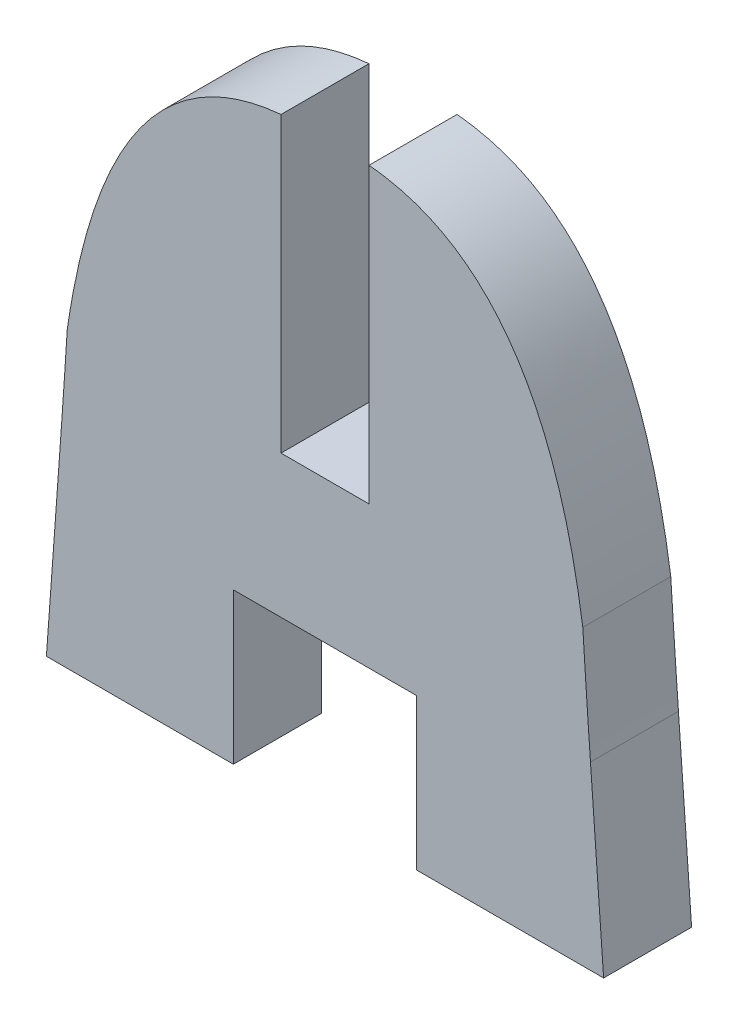
ISO-10303-21;
HEADER;
FILE_DESCRIPTION(('STEP AP214'),'2;1');
FILE_NAME('part.step','',(''),(''),'','','');
FILE_SCHEMA(('AUTOMOTIVE_DESIGN { 1 0 10303 214 1 1 1 1 }'));
ENDSEC;
DATA;
#1=APPLICATION_CONTEXT('core data for automotive mechanical design processes');
#2=APPLICATION_PROTOCOL_DEFINITION('international standard','automotive_design',2000,#1);
#3=PRODUCT_CONTEXT('',#1,'mechanical');
#4=PRODUCT('Part','Part','',(#3));
#5=PRODUCT_RELATED_PRODUCT_CATEGORY('part','',(#4));
#6=PRODUCT_DEFINITION_FORMATION('','',#4);
#7=PRODUCT_DEFINITION_CONTEXT('part definition',#1,'design');
#8=PRODUCT_DEFINITION('design','',#6,#7);
#9=PRODUCT_DEFINITION_SHAPE('','',#8);
#10=(LENGTH_UNIT() NAMED_UNIT(*) SI_UNIT(.MILLI.,.METRE.));
#11=(NAMED_UNIT(*) PLANE_ANGLE_UNIT() SI_UNIT($,.RADIAN.));
#12=(NAMED_UNIT(*) SI_UNIT($,.STERADIAN.) SOLID_ANGLE_UNIT());
#13=UNCERTAINTY_MEASURE_WITH_UNIT(LENGTH_MEASURE(1.E-05),#10,'distance_accuracy_value','');
#14=(GEOMETRIC_REPRESENTATION_CONTEXT(3) GLOBAL_UNCERTAINTY_ASSIGNED_CONTEXT((#13)) GLOBAL_UNIT_ASSIGNED_CONTEXT((#10,
#11,#12)) REPRESENTATION_CONTEXT('',''));
#15=CARTESIAN_POINT('',(0.,0.,0.));
#16=DIRECTION('',(0.,0.,1.));
#17=DIRECTION('',(1.,0.,0.));
#18=AXIS2_PLACEMENT_3D('',#15,#16,#17);
#19=CARTESIAN_POINT('',(18.2899589170951,10.0000000000003,3.));
#20=CARTESIAN_POINT('',(16.9126870363201,19.459463986445,3.));
#21=CARTESIAN_POINT('',(11.0000000000001,20.0000000000003,3.));
#22=B_SPLINE_CURVE_WITH_KNOTS('',2,(#19,#20,#21),.UNSPECIFIED.,.F.,.F.,(3,3),(0.,
0.891892797285202),.UNSPECIFIED.);
#23=DIRECTION('',(0.,0.,-1.));
#24=VECTOR('',#23,1.);
#25=SURFACE_OF_LINEAR_EXTRUSION('',#22,#24);
#26=CARTESIAN_POINT('',(18.2899589170951,10.0000000000003,0.));
#27=CARTESIAN_POINT('',(16.9126870363201,19.459463986445,0.));
#28=CARTESIAN_POINT('',(11.0000000000001,20.0000000000003,0.));
#29=B_SPLINE_CURVE_WITH_KNOTS('',2,(#26,#27,#28),.UNSPECIFIED.,.F.,.F.,(3,3),(0.,
0.891892797285202),.UNSPECIFIED.);
#30=CARTESIAN_POINT('',(18.2899589170951,10.0000000000001,0.));
#31=VERTEX_POINT('',#30);
#32=CARTESIAN_POINT('',(11.0000000000001,20.0000000000003,0.));
#33=VERTEX_POINT('',#32);
#34=EDGE_CURVE('E169',#31,#33,#29,.T.);
#35=ORIENTED_EDGE('',*,*,#34,.T.);
#36=DIRECTION('',(0.,0.,-1.));
#37=VECTOR('',#36,1.);
#38=CARTESIAN_POINT('',(11.0000000000001,20.0000000000003,3.));
#39=LINE('',#38,#37);
#40=CARTESIAN_POINT('',(11.0000000000001,20.0000000000003,3.));
#41=VERTEX_POINT('',#40);
#42=EDGE_CURVE('E11',#41,#33,#39,.T.);
#43=ORIENTED_EDGE('',*,*,#42,.F.);
#44=CARTESIAN_POINT('',(18.2899589170951,10.0000000000001,3.));
#45=VERTEX_POINT('',#44);
#46=EDGE_CURVE('E206',#45,#41,#22,.T.);
#47=ORIENTED_EDGE('',*,*,#46,.F.);
#48=DIRECTION('',(0.,0.,-1.));
#49=VECTOR('',#48,1.);
#50=CARTESIAN_POINT('',(18.2899589170951,10.0000000000001,3.));
#51=LINE('',#50,#49);
#52=EDGE_CURVE('E165',#45,#31,#51,.T.);
#53=ORIENTED_EDGE('',*,*,#52,.T.);
#54=EDGE_LOOP('',(#35,#43,#47,#53));
#55=FACE_BOUND('',#54,.T.);
#56=ADVANCED_FACE('F36',(#55),#25,.F.);
#57=CARTESIAN_POINT('',(11.0000000000001,20.0000000000003,3.));
#58=DIRECTION('',(1.,0.,0.));
#59=DIRECTION('',(0.,0.,-1.));
#60=AXIS2_PLACEMENT_3D('',#57,#58,#59);
#61=PLANE('',#60);
#62=DIRECTION('',(0.,-1.,0.));
#63=VECTOR('',#62,1.);
#64=CARTESIAN_POINT('',(11.0000000000001,20.0000000000003,0.));
#65=LINE('',#64,#63);
#66=CARTESIAN_POINT('',(11.0000000000001,10.0000000000003,0.));
#67=VERTEX_POINT('',#66);
#68=EDGE_CURVE('E174',#33,#67,#65,.T.);
#69=ORIENTED_EDGE('',*,*,#68,.T.);
#70=DIRECTION('',(0.,0.,-1.));
#71=VECTOR('',#70,1.);
#72=CARTESIAN_POINT('',(11.0000000000001,10.0000000000003,3.));
#73=LINE('',#72,#71);
#74=CARTESIAN_POINT('',(11.0000000000001,10.0000000000003,3.));
#75=VERTEX_POINT('',#74);
#76=EDGE_CURVE('E45',#75,#67,#73,.T.);
#77=ORIENTED_EDGE('',*,*,#76,.F.);
#78=DIRECTION('',(0.,-1.,0.));
#79=VECTOR('',#78,1.);
#80=CARTESIAN_POINT('',(11.0000000000001,20.0000000000003,3.));
#81=LINE('',#80,#79);
#82=EDGE_CURVE('E114',#41,#75,#81,.T.);
#83=ORIENTED_EDGE('',*,*,#82,.F.);
#84=ORIENTED_EDGE('',*,*,#42,.T.);
#85=EDGE_LOOP('',(#69,#77,#83,#84));
#86=FACE_BOUND('',#85,.T.);
#87=ADVANCED_FACE('F279',(#86),#61,.F.);
#88=CARTESIAN_POINT('',(8.00000000000006,10.0000000000003,3.));
#89=DIRECTION('',(0.,-1.,0.));
#90=DIRECTION('',(0.,0.,-1.));
#91=AXIS2_PLACEMENT_3D('',#88,#89,#90);
#92=PLANE('',#91);
#93=DIRECTION('',(-1.,0.,0.));
#94=VECTOR('',#93,1.);
#95=CARTESIAN_POINT('',(8.00000000000006,10.0000000000003,0.));
#96=LINE('',#95,#94);
#97=CARTESIAN_POINT('',(8.00000000000006,10.0000000000003,0.));
#98=VERTEX_POINT('',#97);
#99=EDGE_CURVE('E179',#67,#98,#96,.T.);
#100=ORIENTED_EDGE('',*,*,#99,.T.);
#101=DIRECTION('',(0.,0.,-1.));
#102=VECTOR('',#101,1.);
#103=CARTESIAN_POINT('',(8.00000000000006,10.0000000000003,3.));
#104=LINE('',#103,#102);
#105=CARTESIAN_POINT('',(8.00000000000006,10.0000000000003,3.));
#106=VERTEX_POINT('',#105);
#107=EDGE_CURVE('E231',#106,#98,#104,.T.);
#108=ORIENTED_EDGE('',*,*,#107,.F.);
#109=DIRECTION('',(-1.,0.,0.));
#110=VECTOR('',#109,1.);
#111=CARTESIAN_POINT('',(8.00000000000006,10.0000000000003,3.));
#112=LINE('',#111,#110);
#113=EDGE_CURVE('E239',#75,#106,#112,.T.);
#114=ORIENTED_EDGE('',*,*,#113,.F.);
#115=ORIENTED_EDGE('',*,*,#76,.T.);
#116=EDGE_LOOP('',(#100,#108,#114,#115));
#117=FACE_BOUND('',#116,.T.);
#118=ADVANCED_FACE('F237',(#117),#92,.F.);
#119=CARTESIAN_POINT('',(8.00000000000006,10.0000000000003,3.));
#120=DIRECTION('',(-1.,0.,0.));
#121=DIRECTION('',(0.,0.,1.));
#122=AXIS2_PLACEMENT_3D('',#119,#120,#121);
#123=PLANE('',#122);
#124=DIRECTION('',(0.,1.,0.));
#125=VECTOR('',#124,1.);
#126=CARTESIAN_POINT('',(8.00000000000006,10.0000000000003,0.));
#127=LINE('',#126,#125);
#128=CARTESIAN_POINT('',(8.00000000000006,20.0000000000003,0.));
#129=VERTEX_POINT('',#128);
#130=EDGE_CURVE('E181',#98,#129,#127,.T.);
#131=ORIENTED_EDGE('',*,*,#130,.T.);
#132=DIRECTION('',(0.,0.,-1.));
#133=VECTOR('',#132,1.);
#134=CARTESIAN_POINT('',(8.00000000000006,20.0000000000003,3.));
#135=LINE('',#134,#133);
#136=CARTESIAN_POINT('',(8.00000000000006,20.0000000000003,3.));
#137=VERTEX_POINT('',#136);
#138=EDGE_CURVE('E228',#137,#129,#135,.T.);
#139=ORIENTED_EDGE('',*,*,#138,.F.);
#140=DIRECTION('',(0.,1.,0.));
#141=VECTOR('',#140,1.);
#142=CARTESIAN_POINT('',(8.00000000000006,10.0000000000003,3.));
#143=LINE('',#142,#141);
#144=EDGE_CURVE('E257',#106,#137,#143,.T.);
#145=ORIENTED_EDGE('',*,*,#144,.F.);
#146=ORIENTED_EDGE('',*,*,#107,.T.);
#147=EDGE_LOOP('',(#131,#139,#145,#146));
#148=FACE_BOUND('',#147,.T.);
#149=ADVANCED_FACE('F248',(#148),#123,.F.);
#150=CARTESIAN_POINT('',(8.00000000000006,20.0000000000003,3.));
#151=CARTESIAN_POINT('',(2.08731296368017,19.459463986445,3.));
#152=CARTESIAN_POINT('',(0.71004108290551,10.0000000000003,3.));
#153=B_SPLINE_CURVE_WITH_KNOTS('',2,(#150,#151,#152),.UNSPECIFIED.,.F.,.F.,(3,3),(0.,
0.891892797285201),.UNSPECIFIED.);
#154=DIRECTION('',(0.,0.,-1.));
#155=VECTOR('',#154,1.);
#156=SURFACE_OF_LINEAR_EXTRUSION('',#153,#155);
#157=CARTESIAN_POINT('',(8.00000000000006,20.0000000000003,0.));
#158=CARTESIAN_POINT('',(2.08731296368017,19.459463986445,0.));
#159=CARTESIAN_POINT('',(0.71004108290551,10.0000000000003,0.));
#160=B_SPLINE_CURVE_WITH_KNOTS('',2,(#157,#158,#159),.UNSPECIFIED.,.F.,.F.,(3,3),(0.,
0.891892797285201),.UNSPECIFIED.);
#161=CARTESIAN_POINT('',(0.71004108290551,10.0000000000003,0.));
#162=VERTEX_POINT('',#161);
#163=EDGE_CURVE('E183',#129,#162,#160,.T.);
#164=ORIENTED_EDGE('',*,*,#163,.T.);
#165=DIRECTION('',(0.,0.,-1.));
#166=VECTOR('',#165,1.);
#167=CARTESIAN_POINT('',(0.71004108290551,10.0000000000003,3.));
#168=LINE('',#167,#166);
#169=CARTESIAN_POINT('',(0.71004108290551,10.0000000000003,3.));
#170=VERTEX_POINT('',#169);
#171=EDGE_CURVE('E225',#170,#162,#168,.T.);
#172=ORIENTED_EDGE('',*,*,#171,.F.);
#173=EDGE_CURVE('E254',#137,#170,#153,.T.);
#174=ORIENTED_EDGE('',*,*,#173,.F.);
#175=ORIENTED_EDGE('',*,*,#138,.T.);
#176=EDGE_LOOP('',(#164,#172,#174,#175));
#177=FACE_BOUND('',#176,.T.);
#178=ADVANCED_FACE('F252',(#177),#156,.F.);
#179=CARTESIAN_POINT('',(-388.518777082135,34.5138146734916,3.));
#180=DIRECTION('',(0.,0.,-1.));
#181=DIRECTION('',(-1.,0.,0.));
#182=AXIS2_PLACEMENT_3D('',#179,#180,#181);
#183=CYLINDRICAL_SURFACE('',#182,390.);
#184=CARTESIAN_POINT('',(-388.518777082135,34.5138146734916,0.));
#185=DIRECTION('',(0.,0.,-1.));
#186=DIRECTION('',(1.,0.,0.));
#187=AXIS2_PLACEMENT_3D('',#184,#185,#186);
#188=CIRCLE('',#187,390.);
#189=CARTESIAN_POINT('',(0.448555141237317,6.15161336553631,0.));
#190=VERTEX_POINT('',#189);
#191=EDGE_CURVE('E187',#162,#190,#188,.T.);
#192=ORIENTED_EDGE('',*,*,#191,.T.);
#193=DIRECTION('',(0.,0.,-1.));
#194=VECTOR('',#193,1.);
#195=CARTESIAN_POINT('',(0.448555141237317,6.15161336553631,3.));
#196=LINE('',#195,#194);
#197=CARTESIAN_POINT('',(0.448555141237317,6.15161336553631,3.));
#198=VERTEX_POINT('',#197);
#199=EDGE_CURVE('E222',#198,#190,#196,.T.);
#200=ORIENTED_EDGE('',*,*,#199,.F.);
#201=CARTESIAN_POINT('',(-388.518777082135,34.5138146734916,3.));
#202=DIRECTION('',(0.,0.,-1.));
#203=DIRECTION('',(1.,0.,0.));
#204=AXIS2_PLACEMENT_3D('',#201,#202,#203);
#205=CIRCLE('',#204,390.);
#206=EDGE_CURVE('E256',#170,#198,#205,.T.);
#207=ORIENTED_EDGE('',*,*,#206,.F.);
#208=ORIENTED_EDGE('',*,*,#171,.T.);
#209=EDGE_LOOP('',(#192,#200,#207,#208));
#210=FACE_BOUND('',#209,.T.);
#211=ADVANCED_FACE('F274',(#210),#183,.F.);
#212=CARTESIAN_POINT('',(0.,0.,3.));
#213=DIRECTION('',(0.997352133906081,-0.072723593097336,0.));
#214=DIRECTION('',(0.072723593097336,0.997352133906081,0.));
#215=AXIS2_PLACEMENT_3D('',#212,#213,#214);
#216=PLANE('',#215);
#217=DIRECTION('',(-0.072723593097336,-0.997352133906081,0.));
#218=VECTOR('',#217,1.);
#219=CARTESIAN_POINT('',(0.,0.,0.));
#220=LINE('',#219,#218);
#221=CARTESIAN_POINT('',(0.,0.,0.));
#222=VERTEX_POINT('',#221);
#223=EDGE_CURVE('E192',#190,#222,#220,.T.);
#224=ORIENTED_EDGE('',*,*,#223,.T.);
#225=DIRECTION('',(0.,0.,-1.));
#226=VECTOR('',#225,1.);
#227=CARTESIAN_POINT('',(0.,0.,3.));
#228=LINE('',#227,#226);
#229=CARTESIAN_POINT('',(0.,0.,3.));
#230=VERTEX_POINT('',#229);
#231=EDGE_CURVE('E219',#230,#222,#228,.T.);
#232=ORIENTED_EDGE('',*,*,#231,.F.);
#233=DIRECTION('',(-0.072723593097336,-0.997352133906081,0.));
#234=VECTOR('',#233,1.);
#235=CARTESIAN_POINT('',(0.,0.,3.));
#236=LINE('',#235,#234);
#237=EDGE_CURVE('E259',#198,#230,#236,.T.);
#238=ORIENTED_EDGE('',*,*,#237,.F.);
#239=ORIENTED_EDGE('',*,*,#199,.T.);
#240=EDGE_LOOP('',(#224,#232,#238,#239));
#241=FACE_BOUND('',#240,.T.);
#242=ADVANCED_FACE('F311',(#241),#216,.F.);
#243=CARTESIAN_POINT('',(6.37500000000006,0.,3.));
#244=DIRECTION('',(0.,1.,0.));
#245=DIRECTION('',(-1.,0.,0.));
#246=AXIS2_PLACEMENT_3D('',#243,#244,#245);
#247=PLANE('',#246);
#248=DIRECTION('',(1.,0.,0.));
#249=VECTOR('',#248,1.);
#250=CARTESIAN_POINT('',(6.37500000000006,0.,0.));
#251=LINE('',#250,#249);
#252=CARTESIAN_POINT('',(6.37500000000006,0.,0.));
#253=VERTEX_POINT('',#252);
#254=EDGE_CURVE('E194',#222,#253,#251,.T.);
#255=ORIENTED_EDGE('',*,*,#254,.T.);
#256=DIRECTION('',(0.,0.,-1.));
#257=VECTOR('',#256,1.);
#258=CARTESIAN_POINT('',(6.37500000000006,0.,3.));
#259=LINE('',#258,#257);
#260=CARTESIAN_POINT('',(6.37500000000006,0.,3.));
#261=VERTEX_POINT('',#260);
#262=EDGE_CURVE('E216',#261,#253,#259,.T.);
#263=ORIENTED_EDGE('',*,*,#262,.F.);
#264=DIRECTION('',(1.,0.,0.));
#265=VECTOR('',#264,1.);
#266=CARTESIAN_POINT('',(6.37500000000006,0.,3.));
#267=LINE('',#266,#265);
#268=EDGE_CURVE('E308',#230,#261,#267,.T.);
#269=ORIENTED_EDGE('',*,*,#268,.F.);
#270=ORIENTED_EDGE('',*,*,#231,.T.);
#271=EDGE_LOOP('',(#255,#263,#269,#270));
#272=FACE_BOUND('',#271,.T.);
#273=ADVANCED_FACE('F305',(#272),#247,.F.);
#274=CARTESIAN_POINT('',(6.37500000000006,5.15000000000078,3.));
#275=DIRECTION('',(-1.,0.,0.));
#276=DIRECTION('',(0.,0.,1.));
#277=AXIS2_PLACEMENT_3D('',#274,#275,#276);
#278=PLANE('',#277);
#279=DIRECTION('',(0.,1.,0.));
#280=VECTOR('',#279,1.);
#281=CARTESIAN_POINT('',(6.37500000000006,5.15000000000078,0.));
#282=LINE('',#281,#280);
#283=CARTESIAN_POINT('',(6.37500000000006,5.15000000000078,0.));
#284=VERTEX_POINT('',#283);
#285=EDGE_CURVE('E196',#253,#284,#282,.T.);
#286=ORIENTED_EDGE('',*,*,#285,.T.);
#287=DIRECTION('',(0.,0.,-1.));
#288=VECTOR('',#287,1.);
#289=CARTESIAN_POINT('',(6.37500000000006,5.15000000000078,3.));
#290=LINE('',#289,#288);
#291=CARTESIAN_POINT('',(6.37500000000006,5.15000000000078,3.));
#292=VERTEX_POINT('',#291);
#293=EDGE_CURVE('E213',#292,#284,#290,.T.);
#294=ORIENTED_EDGE('',*,*,#293,.F.);
#295=DIRECTION('',(0.,1.,0.));
#296=VECTOR('',#295,1.);
#297=CARTESIAN_POINT('',(6.37500000000006,5.15000000000078,3.));
#298=LINE('',#297,#296);
#299=EDGE_CURVE('E300',#261,#292,#298,.T.);
#300=ORIENTED_EDGE('',*,*,#299,.F.);
#301=ORIENTED_EDGE('',*,*,#262,.T.);
#302=EDGE_LOOP('',(#286,#294,#300,#301));
#303=FACE_BOUND('',#302,.T.);
#304=ADVANCED_FACE('F299',(#303),#278,.F.);
#305=CARTESIAN_POINT('',(12.6250000000001,5.15000000000078,3.));
#306=DIRECTION('',(0.,1.,0.));
#307=DIRECTION('',(0.,0.,1.));
#308=AXIS2_PLACEMENT_3D('',#305,#306,#307);
#309=PLANE('',#308);
#310=DIRECTION('',(1.,0.,0.));
#311=VECTOR('',#310,1.);
#312=CARTESIAN_POINT('',(12.6250000000001,5.15000000000078,0.));
#313=LINE('',#312,#311);
#314=CARTESIAN_POINT('',(12.6250000000001,5.15000000000078,0.));
#315=VERTEX_POINT('',#314);
#316=EDGE_CURVE('E199',#284,#315,#313,.T.);
#317=ORIENTED_EDGE('',*,*,#316,.T.);
#318=DIRECTION('',(0.,0.,-1.));
#319=VECTOR('',#318,1.);
#320=CARTESIAN_POINT('',(12.6250000000001,5.15000000000078,3.));
#321=LINE('',#320,#319);
#322=CARTESIAN_POINT('',(12.6250000000001,5.15000000000078,3.));
#323=VERTEX_POINT('',#322);
#324=EDGE_CURVE('E210',#323,#315,#321,.T.);
#325=ORIENTED_EDGE('',*,*,#324,.F.);
#326=DIRECTION('',(1.,0.,0.));
#327=VECTOR('',#326,1.);
#328=CARTESIAN_POINT('',(7.99999999996254,5.15000000000078,3.));
#329=LINE('',#328,#327);
#330=EDGE_CURVE('E295',#292,#323,#329,.T.);
#331=ORIENTED_EDGE('',*,*,#330,.F.);
#332=ORIENTED_EDGE('',*,*,#293,.T.);
#333=EDGE_LOOP('',(#317,#325,#331,#332));
#334=FACE_BOUND('',#333,.T.);
#335=ADVANCED_FACE('F294',(#334),#309,.F.);
#336=CARTESIAN_POINT('',(12.6250000000001,5.15000000000078,3.));
#337=DIRECTION('',(1.,0.,0.));
#338=DIRECTION('',(0.,0.,-1.));
#339=AXIS2_PLACEMENT_3D('',#336,#337,#338);
#340=PLANE('',#339);
#341=DIRECTION('',(0.,-1.,0.));
#342=VECTOR('',#341,1.);
#343=CARTESIAN_POINT('',(12.6250000000001,5.15000000000078,0.));
#344=LINE('',#343,#342);
#345=CARTESIAN_POINT('',(12.6250000000001,0.,0.));
#346=VERTEX_POINT('',#345);
#347=EDGE_CURVE('E201',#315,#346,#344,.T.);
#348=ORIENTED_EDGE('',*,*,#347,.T.);
#349=DIRECTION('',(0.,0.,-1.));
#350=VECTOR('',#349,1.);
#351=CARTESIAN_POINT('',(12.6250000000001,0.,3.));
#352=LINE('',#351,#350);
#353=CARTESIAN_POINT('',(12.6250000000001,0.,3.));
#354=VERTEX_POINT('',#353);
#355=EDGE_CURVE('E160',#354,#346,#352,.T.);
#356=ORIENTED_EDGE('',*,*,#355,.F.);
#357=DIRECTION('',(0.,-1.,0.));
#358=VECTOR('',#357,1.);
#359=CARTESIAN_POINT('',(12.6250000000001,5.15000000000078,3.));
#360=LINE('',#359,#358);
#361=EDGE_CURVE('E151',#323,#354,#360,.T.);
#362=ORIENTED_EDGE('',*,*,#361,.F.);
#363=ORIENTED_EDGE('',*,*,#324,.T.);
#364=EDGE_LOOP('',(#348,#356,#362,#363));
#365=FACE_BOUND('',#364,.T.);
#366=ADVANCED_FACE('F290',(#365),#340,.F.);
#367=CARTESIAN_POINT('',(19.0000000000001,1.11022302462516E-13,3.));
#368=DIRECTION('',(0.,1.,0.));
#369=DIRECTION('',(-1.,0.,0.));
#370=AXIS2_PLACEMENT_3D('',#367,#368,#369);
#371=PLANE('',#370);
#372=DIRECTION('',(1.,0.,0.));
#373=VECTOR('',#372,1.);
#374=CARTESIAN_POINT('',(19.0000000000001,1.11022302462516E-13,0.));
#375=LINE('',#374,#373);
#376=CARTESIAN_POINT('',(19.0000000000001,1.11022302462516E-13,0.));
#377=VERTEX_POINT('',#376);
#378=EDGE_CURVE('E159',#346,#377,#375,.T.);
#379=ORIENTED_EDGE('',*,*,#378,.T.);
#380=DIRECTION('',(0.,0.,-1.));
#381=VECTOR('',#380,1.);
#382=CARTESIAN_POINT('',(19.0000000000001,1.11022302462516E-13,3.));
#383=LINE('',#382,#381);
#384=CARTESIAN_POINT('',(19.0000000000001,1.11022302462516E-13,3.));
#385=VERTEX_POINT('',#384);
#386=EDGE_CURVE('E156',#385,#377,#383,.T.);
#387=ORIENTED_EDGE('',*,*,#386,.F.);
#388=DIRECTION('',(1.,0.,0.));
#389=VECTOR('',#388,1.);
#390=CARTESIAN_POINT('',(19.0000000000001,1.11022302462516E-13,3.));
#391=LINE('',#390,#389);
#392=EDGE_CURVE('E145',#354,#385,#391,.T.);
#393=ORIENTED_EDGE('',*,*,#392,.F.);
#394=ORIENTED_EDGE('',*,*,#355,.T.);
#395=EDGE_LOOP('',(#379,#387,#393,#394));
#396=FACE_BOUND('',#395,.T.);
#397=ADVANCED_FACE('F157',(#396),#371,.F.);
#398=CARTESIAN_POINT('',(19.0000000000001,1.11022302462516E-13,3.));
#399=DIRECTION('',(-0.997352133906081,-0.072723593097332,0.));
#400=DIRECTION('',(0.0727235930973321,-0.997352133906081,0.));
#401=AXIS2_PLACEMENT_3D('',#398,#399,#400);
#402=PLANE('',#401);
#403=DIRECTION('',(-0.0727235930973321,0.997352133906081,0.));
#404=VECTOR('',#403,1.);
#405=CARTESIAN_POINT('',(19.0000000000001,1.11022302462516E-13,0.));
#406=LINE('',#405,#404);
#407=CARTESIAN_POINT('',(18.5514448587631,6.15161336553502,0.));
#408=VERTEX_POINT('',#407);
#409=EDGE_CURVE('E100',#377,#408,#406,.T.);
#410=ORIENTED_EDGE('',*,*,#409,.T.);
#411=DIRECTION('',(0.,0.,-1.));
#412=VECTOR('',#411,1.);
#413=CARTESIAN_POINT('',(18.5514448587631,6.15161336553502,3.));
#414=LINE('',#413,#412);
#415=CARTESIAN_POINT('',(18.5514448587631,6.15161336553502,3.));
#416=VERTEX_POINT('',#415);
#417=EDGE_CURVE('E161',#416,#408,#414,.T.);
#418=ORIENTED_EDGE('',*,*,#417,.F.);
#419=DIRECTION('',(-0.0727235930973321,0.997352133906081,0.));
#420=VECTOR('',#419,1.);
#421=CARTESIAN_POINT('',(19.0000000000001,1.11022302462516E-13,3.));
#422=LINE('',#421,#420);
#423=EDGE_CURVE('E149',#385,#416,#422,.T.);
#424=ORIENTED_EDGE('',*,*,#423,.F.);
#425=ORIENTED_EDGE('',*,*,#386,.T.);
#426=EDGE_LOOP('',(#410,#418,#424,#425));
#427=FACE_BOUND('',#426,.T.);
#428=ADVANCED_FACE('F163',(#427),#402,.F.);
#429=CARTESIAN_POINT('',(407.518777082135,34.5138146734958,3.));
#430=DIRECTION('',(0.,0.,-1.));
#431=DIRECTION('',(-1.,0.,0.));
#432=AXIS2_PLACEMENT_3D('',#429,#430,#431);
#433=CYLINDRICAL_SURFACE('',#432,390.);
#434=CARTESIAN_POINT('',(407.518777082135,34.5138146734958,0.));
#435=DIRECTION('',(0.,0.,-1.));
#436=DIRECTION('',(-1.,0.,0.));
#437=AXIS2_PLACEMENT_3D('',#434,#435,#436);
#438=CIRCLE('',#437,390.);
#439=EDGE_CURVE('E106',#408,#31,#438,.T.);
#440=ORIENTED_EDGE('',*,*,#439,.T.);
#441=ORIENTED_EDGE('',*,*,#52,.F.);
#442=CARTESIAN_POINT('',(407.518777082135,34.5138146734958,3.));
#443=DIRECTION('',(0.,0.,-1.));
#444=DIRECTION('',(-1.,0.,0.));
#445=AXIS2_PLACEMENT_3D('',#442,#443,#444);
#446=CIRCLE('',#445,390.);
#447=EDGE_CURVE('E53',#416,#45,#446,.T.);
#448=ORIENTED_EDGE('',*,*,#447,.F.);
#449=ORIENTED_EDGE('',*,*,#417,.T.);
#450=EDGE_LOOP('',(#440,#441,#448,#449));
#451=FACE_BOUND('',#450,.T.);
#452=ADVANCED_FACE('F336',(#451),#433,.F.);
#453=CARTESIAN_POINT('',(15.7788332474338,17.2297319932227,3.));
#454=DIRECTION('',(0.,0.,-1.));
#455=DIRECTION('',(-1.,0.,0.));
#456=AXIS2_PLACEMENT_3D('',#453,#454,#455);
#457=PLANE('',#456);
#458=ORIENTED_EDGE('',*,*,#46,.T.);
#459=ORIENTED_EDGE('',*,*,#82,.T.);
#460=ORIENTED_EDGE('',*,*,#113,.T.);
#461=ORIENTED_EDGE('',*,*,#144,.T.);
#462=ORIENTED_EDGE('',*,*,#173,.T.);
#463=ORIENTED_EDGE('',*,*,#206,.T.);
#464=ORIENTED_EDGE('',*,*,#237,.T.);
#465=ORIENTED_EDGE('',*,*,#268,.T.);
#466=ORIENTED_EDGE('',*,*,#299,.T.);
#467=ORIENTED_EDGE('',*,*,#330,.T.);
#468=ORIENTED_EDGE('',*,*,#361,.T.);
#469=ORIENTED_EDGE('',*,*,#392,.T.);
#470=ORIENTED_EDGE('',*,*,#423,.T.);
#471=ORIENTED_EDGE('',*,*,#447,.T.);
#472=EDGE_LOOP('',(#458,#459,#460,#461,#462,#463,#464,#465,#466,#467,#468,#469,#470,#471));
#473=FACE_BOUND('',#472,.T.);
#474=ADVANCED_FACE('F147',(#473),#457,.F.);
#475=CARTESIAN_POINT('',(15.7788332474338,17.2297319932227,0.));
#476=DIRECTION('',(0.,0.,-1.));
#477=DIRECTION('',(-1.,0.,0.));
#478=AXIS2_PLACEMENT_3D('',#475,#476,#477);
#479=PLANE('',#478);
#480=ORIENTED_EDGE('',*,*,#34,.F.);
#481=ORIENTED_EDGE('',*,*,#439,.F.);
#482=ORIENTED_EDGE('',*,*,#409,.F.);
#483=ORIENTED_EDGE('',*,*,#378,.F.);
#484=ORIENTED_EDGE('',*,*,#347,.F.);
#485=ORIENTED_EDGE('',*,*,#316,.F.);
#486=ORIENTED_EDGE('',*,*,#285,.F.);
#487=ORIENTED_EDGE('',*,*,#254,.F.);
#488=ORIENTED_EDGE('',*,*,#223,.F.);
#489=ORIENTED_EDGE('',*,*,#191,.F.);
#490=ORIENTED_EDGE('',*,*,#163,.F.);
#491=ORIENTED_EDGE('',*,*,#130,.F.);
#492=ORIENTED_EDGE('',*,*,#99,.F.);
#493=ORIENTED_EDGE('',*,*,#68,.F.);
#494=EDGE_LOOP('',(#480,#481,#482,#483,#484,#485,#486,#487,#488,#489,#490,#491,#492,#493));
#495=FACE_BOUND('',#494,.T.);
#496=ADVANCED_FACE('F243',(#495),#479,.T.);
#497=CLOSED_SHELL('',(#56,#87,#118,#149,#178,#211,#242,#273,#304,#335,#366,#397,#428,#452,#474,#496));
#498=MANIFOLD_SOLID_BREP('B2',#497);
#499=ADVANCED_BREP_SHAPE_REPRESENTATION('',(#18,#498),#14);
#500=SHAPE_DEFINITION_REPRESENTATION(#9,#499);
ENDSEC;
END-ISO-10303-21;
